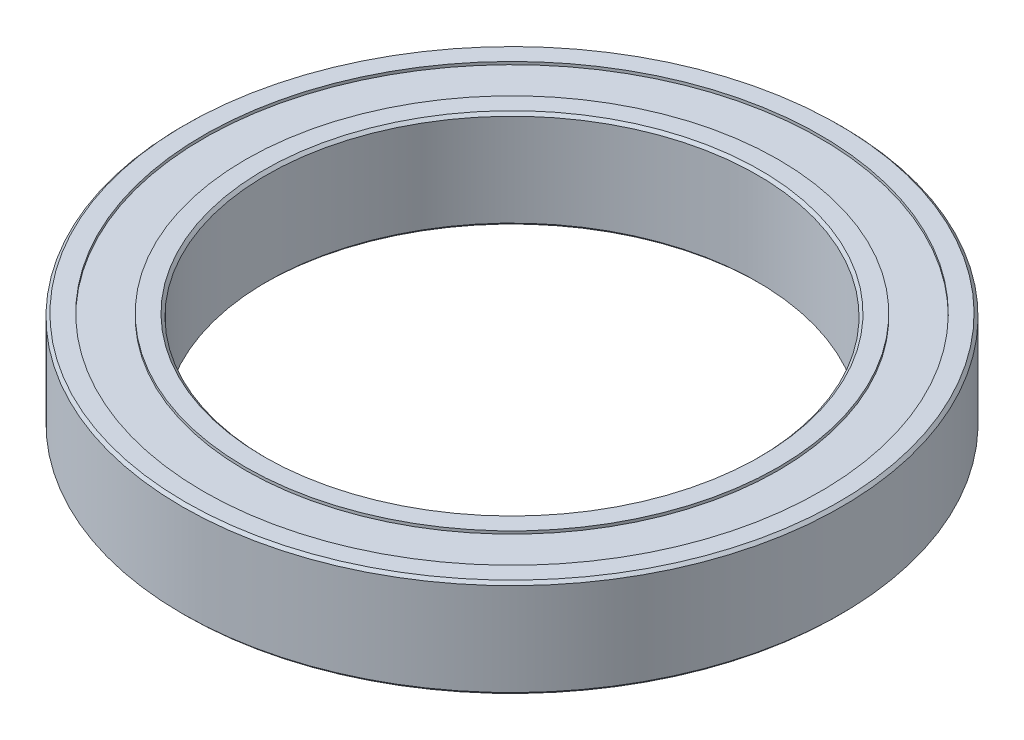
ISO-10303-21;
HEADER;
FILE_DESCRIPTION(('STEP AP214'),'2;1');
FILE_NAME('part.step','',(''),(''),'','','');
FILE_SCHEMA(('AUTOMOTIVE_DESIGN { 1 0 10303 214 1 1 1 1 }'));
ENDSEC;
DATA;
#1=APPLICATION_CONTEXT('core data for automotive mechanical design processes');
#2=APPLICATION_PROTOCOL_DEFINITION('international standard','automotive_design',2000,#1);
#3=PRODUCT_CONTEXT('',#1,'mechanical');
#4=PRODUCT('Part','Part','',(#3));
#5=PRODUCT_RELATED_PRODUCT_CATEGORY('part','',(#4));
#6=PRODUCT_DEFINITION_FORMATION('','',#4);
#7=PRODUCT_DEFINITION_CONTEXT('part definition',#1,'design');
#8=PRODUCT_DEFINITION('design','',#6,#7);
#9=PRODUCT_DEFINITION_SHAPE('','',#8);
#10=(LENGTH_UNIT() NAMED_UNIT(*) SI_UNIT(.MILLI.,.METRE.));
#11=(NAMED_UNIT(*) PLANE_ANGLE_UNIT() SI_UNIT($,.RADIAN.));
#12=(NAMED_UNIT(*) SI_UNIT($,.STERADIAN.) SOLID_ANGLE_UNIT());
#13=UNCERTAINTY_MEASURE_WITH_UNIT(LENGTH_MEASURE(1.E-05),#10,'distance_accuracy_value','');
#14=(GEOMETRIC_REPRESENTATION_CONTEXT(3) GLOBAL_UNCERTAINTY_ASSIGNED_CONTEXT((#13)) GLOBAL_UNIT_ASSIGNED_CONTEXT((#10,
#11,#12)) REPRESENTATION_CONTEXT('',''));
#15=CARTESIAN_POINT('',(0.,0.,0.));
#16=DIRECTION('',(0.,0.,1.));
#17=DIRECTION('',(1.,0.,0.));
#18=AXIS2_PLACEMENT_3D('',#15,#16,#17);
#19=CARTESIAN_POINT('',(0.,0.,0.));
#20=DIRECTION('',(0.,1.,0.));
#21=DIRECTION('',(0.,0.,1.));
#22=AXIS2_PLACEMENT_3D('',#19,#20,#21);
#23=PLANE('',#22);
#24=CARTESIAN_POINT('',(0.,0.,0.));
#25=DIRECTION('',(0.,1.,0.));
#26=DIRECTION('',(0.,0.,1.));
#27=AXIS2_PLACEMENT_3D('',#24,#25,#26);
#28=CIRCLE('',#27,17.7);
#29=CARTESIAN_POINT('',(0.,0.,17.7));
#30=VERTEX_POINT('',#29);
#31=EDGE_CURVE('E10',#30,#30,#28,.T.);
#32=ORIENTED_EDGE('',*,*,#31,.T.);
#33=EDGE_LOOP('',(#32));
#34=FACE_BOUND('',#33,.T.);
#35=CARTESIAN_POINT('',(0.,0.,0.));
#36=DIRECTION('',(0.,-1.,0.));
#37=DIRECTION('',(0.,0.,-1.));
#38=AXIS2_PLACEMENT_3D('',#35,#36,#37);
#39=CIRCLE('',#38,19.);
#40=CARTESIAN_POINT('',(0.,0.,-19.));
#41=VERTEX_POINT('',#40);
#42=EDGE_CURVE('E86',#41,#41,#39,.T.);
#43=ORIENTED_EDGE('',*,*,#42,.T.);
#44=EDGE_LOOP('',(#43));
#45=FACE_BOUND('',#44,.T.);
#46=ADVANCED_FACE('F34',(#34,#45),#23,.F.);
#47=CARTESIAN_POINT('',(0.,7.,0.));
#48=DIRECTION('',(0.,1.,0.));
#49=DIRECTION('',(0.,0.,1.));
#50=AXIS2_PLACEMENT_3D('',#47,#48,#49);
#51=PLANE('',#50);
#52=CARTESIAN_POINT('',(0.,7.,0.));
#53=DIRECTION('',(0.,1.,0.));
#54=DIRECTION('',(0.,0.,1.));
#55=AXIS2_PLACEMENT_3D('',#52,#53,#54);
#56=CIRCLE('',#55,17.7);
#57=CARTESIAN_POINT('',(0.,7.,17.7));
#58=VERTEX_POINT('',#57);
#59=EDGE_CURVE('E42',#58,#58,#56,.F.);
#60=ORIENTED_EDGE('',*,*,#59,.T.);
#61=EDGE_LOOP('',(#60));
#62=FACE_BOUND('',#61,.T.);
#63=CARTESIAN_POINT('',(0.,7.,0.));
#64=DIRECTION('',(0.,1.,0.));
#65=DIRECTION('',(0.,0.,1.));
#66=AXIS2_PLACEMENT_3D('',#63,#64,#65);
#67=CIRCLE('',#66,19.);
#68=CARTESIAN_POINT('',(0.,7.,19.));
#69=VERTEX_POINT('',#68);
#70=EDGE_CURVE('E74',#69,#69,#67,.T.);
#71=ORIENTED_EDGE('',*,*,#70,.T.);
#72=EDGE_LOOP('',(#71));
#73=FACE_BOUND('',#72,.T.);
#74=ADVANCED_FACE('F121',(#62,#73),#51,.T.);
#75=CARTESIAN_POINT('',(0.,7.,0.));
#76=DIRECTION('',(0.,1.,0.));
#77=DIRECTION('',(0.,0.,1.));
#78=AXIS2_PLACEMENT_3D('',#75,#76,#77);
#79=CIRCLE('',#78,23.3);
#80=CARTESIAN_POINT('',(0.,7.,23.3));
#81=VERTEX_POINT('',#80);
#82=EDGE_CURVE('E64',#81,#81,#79,.T.);
#83=ORIENTED_EDGE('',*,*,#82,.T.);
#84=EDGE_LOOP('',(#83));
#85=FACE_BOUND('',#84,.T.);
#86=CARTESIAN_POINT('',(0.,7.,0.));
#87=DIRECTION('',(0.,1.,0.));
#88=DIRECTION('',(0.,0.,1.));
#89=AXIS2_PLACEMENT_3D('',#86,#87,#88);
#90=CIRCLE('',#89,22.);
#91=CARTESIAN_POINT('',(0.,7.,22.));
#92=VERTEX_POINT('',#91);
#93=EDGE_CURVE('E68',#92,#92,#90,.T.);
#94=ORIENTED_EDGE('',*,*,#93,.F.);
#95=EDGE_LOOP('',(#94));
#96=FACE_BOUND('',#95,.T.);
#97=ADVANCED_FACE('F111',(#85,#96),#51,.T.);
#98=CARTESIAN_POINT('',(0.,0.,0.));
#99=DIRECTION('',(0.,1.,0.));
#100=DIRECTION('',(0.,0.,1.));
#101=AXIS2_PLACEMENT_3D('',#98,#99,#100);
#102=CIRCLE('',#101,23.3);
#103=CARTESIAN_POINT('',(0.,0.,23.3));
#104=VERTEX_POINT('',#103);
#105=EDGE_CURVE('E55',#104,#104,#102,.F.);
#106=ORIENTED_EDGE('',*,*,#105,.T.);
#107=EDGE_LOOP('',(#106));
#108=FACE_BOUND('',#107,.T.);
#109=CARTESIAN_POINT('',(0.,0.,0.));
#110=DIRECTION('',(0.,-1.,0.));
#111=DIRECTION('',(0.,0.,-1.));
#112=AXIS2_PLACEMENT_3D('',#109,#110,#111);
#113=CIRCLE('',#112,22.);
#114=CARTESIAN_POINT('',(0.,0.,-22.));
#115=VERTEX_POINT('',#114);
#116=EDGE_CURVE('E80',#115,#115,#113,.T.);
#117=ORIENTED_EDGE('',*,*,#116,.F.);
#118=EDGE_LOOP('',(#117));
#119=FACE_BOUND('',#118,.T.);
#120=ADVANCED_FACE('F108',(#108,#119),#23,.F.);
#121=CARTESIAN_POINT('',(0.,7.,0.));
#122=DIRECTION('',(0.,-1.,0.));
#123=DIRECTION('',(0.,0.,-1.));
#124=AXIS2_PLACEMENT_3D('',#121,#122,#123);
#125=CYLINDRICAL_SURFACE('',#124,23.5);
#126=CARTESIAN_POINT('',(0.,6.8,0.));
#127=DIRECTION('',(0.,1.,0.));
#128=DIRECTION('',(0.,0.,1.));
#129=AXIS2_PLACEMENT_3D('',#126,#127,#128);
#130=CIRCLE('',#129,23.5);
#131=CARTESIAN_POINT('',(0.,6.8,23.5));
#132=VERTEX_POINT('',#131);
#133=EDGE_CURVE('E58',#132,#132,#130,.F.);
#134=ORIENTED_EDGE('',*,*,#133,.T.);
#135=EDGE_LOOP('',(#134));
#136=FACE_BOUND('',#135,.T.);
#137=CARTESIAN_POINT('',(0.,0.200000000000006,0.));
#138=DIRECTION('',(0.,1.,0.));
#139=DIRECTION('',(0.,0.,1.));
#140=AXIS2_PLACEMENT_3D('',#137,#138,#139);
#141=CIRCLE('',#140,23.5);
#142=CARTESIAN_POINT('',(0.,0.200000000000006,23.5));
#143=VERTEX_POINT('',#142);
#144=EDGE_CURVE('E61',#143,#143,#141,.T.);
#145=ORIENTED_EDGE('',*,*,#144,.T.);
#146=EDGE_LOOP('',(#145));
#147=FACE_BOUND('',#146,.T.);
#148=ADVANCED_FACE('F110',(#136,#147),#125,.T.);
#149=CARTESIAN_POINT('',(0.,7.,0.));
#150=DIRECTION('',(0.,-1.,0.));
#151=DIRECTION('',(0.,0.,-1.));
#152=AXIS2_PLACEMENT_3D('',#149,#150,#151);
#153=CYLINDRICAL_SURFACE('',#152,17.5);
#154=CARTESIAN_POINT('',(0.,6.80000000000002,0.));
#155=DIRECTION('',(0.,1.,0.));
#156=DIRECTION('',(0.,0.,1.));
#157=AXIS2_PLACEMENT_3D('',#154,#155,#156);
#158=CIRCLE('',#157,17.5);
#159=CARTESIAN_POINT('',(0.,6.80000000000002,17.5));
#160=VERTEX_POINT('',#159);
#161=EDGE_CURVE('E46',#160,#160,#158,.T.);
#162=ORIENTED_EDGE('',*,*,#161,.T.);
#163=EDGE_LOOP('',(#162));
#164=FACE_BOUND('',#163,.T.);
#165=CARTESIAN_POINT('',(0.,0.199999999999999,0.));
#166=DIRECTION('',(0.,1.,0.));
#167=DIRECTION('',(0.,0.,1.));
#168=AXIS2_PLACEMENT_3D('',#165,#166,#167);
#169=CIRCLE('',#168,17.5);
#170=CARTESIAN_POINT('',(0.,0.199999999999999,17.5));
#171=VERTEX_POINT('',#170);
#172=EDGE_CURVE('E50',#171,#171,#169,.F.);
#173=ORIENTED_EDGE('',*,*,#172,.T.);
#174=EDGE_LOOP('',(#173));
#175=FACE_BOUND('',#174,.T.);
#176=ADVANCED_FACE('F118',(#164,#175),#153,.F.);
#177=CARTESIAN_POINT('',(0.,6.8,0.));
#178=DIRECTION('',(0.,1.,0.));
#179=DIRECTION('',(0.,0.,1.));
#180=AXIS2_PLACEMENT_3D('',#177,#178,#179);
#181=CYLINDRICAL_SURFACE('',#180,22.);
#182=CARTESIAN_POINT('',(0.,6.8,0.));
#183=DIRECTION('',(0.,1.,0.));
#184=DIRECTION('',(0.,0.,1.));
#185=AXIS2_PLACEMENT_3D('',#182,#183,#184);
#186=CIRCLE('',#185,22.);
#187=CARTESIAN_POINT('',(0.,6.8,22.));
#188=VERTEX_POINT('',#187);
#189=EDGE_CURVE('E67',#188,#188,#186,.T.);
#190=ORIENTED_EDGE('',*,*,#189,.F.);
#191=EDGE_LOOP('',(#190));
#192=FACE_BOUND('',#191,.T.);
#193=ORIENTED_EDGE('',*,*,#93,.T.);
#194=EDGE_LOOP('',(#193));
#195=FACE_BOUND('',#194,.T.);
#196=ADVANCED_FACE('F146',(#192,#195),#181,.F.);
#197=CARTESIAN_POINT('',(0.,6.8,0.));
#198=DIRECTION('',(0.,1.,0.));
#199=DIRECTION('',(0.,0.,1.));
#200=AXIS2_PLACEMENT_3D('',#197,#198,#199);
#201=PLANE('',#200);
#202=CARTESIAN_POINT('',(0.,6.8,0.));
#203=DIRECTION('',(0.,1.,0.));
#204=DIRECTION('',(0.,0.,1.));
#205=AXIS2_PLACEMENT_3D('',#202,#203,#204);
#206=CIRCLE('',#205,19.);
#207=CARTESIAN_POINT('',(0.,6.8,19.));
#208=VERTEX_POINT('',#207);
#209=EDGE_CURVE('E71',#208,#208,#206,.T.);
#210=ORIENTED_EDGE('',*,*,#209,.F.);
#211=EDGE_LOOP('',(#210));
#212=FACE_BOUND('',#211,.T.);
#213=ORIENTED_EDGE('',*,*,#189,.T.);
#214=EDGE_LOOP('',(#213));
#215=FACE_BOUND('',#214,.T.);
#216=ADVANCED_FACE('F142',(#212,#215),#201,.T.);
#217=CARTESIAN_POINT('',(0.,6.8,0.));
#218=DIRECTION('',(0.,1.,0.));
#219=DIRECTION('',(0.,0.,1.));
#220=AXIS2_PLACEMENT_3D('',#217,#218,#219);
#221=CYLINDRICAL_SURFACE('',#220,19.);
#222=ORIENTED_EDGE('',*,*,#209,.T.);
#223=EDGE_LOOP('',(#222));
#224=FACE_BOUND('',#223,.T.);
#225=ORIENTED_EDGE('',*,*,#70,.F.);
#226=EDGE_LOOP('',(#225));
#227=FACE_BOUND('',#226,.T.);
#228=ADVANCED_FACE('F104',(#224,#227),#221,.T.);
#229=CARTESIAN_POINT('',(0.,0.2,0.));
#230=DIRECTION('',(0.,-1.,0.));
#231=DIRECTION('',(0.,0.,-1.));
#232=AXIS2_PLACEMENT_3D('',#229,#230,#231);
#233=CYLINDRICAL_SURFACE('',#232,22.);
#234=CARTESIAN_POINT('',(0.,0.2,0.));
#235=DIRECTION('',(0.,-1.,0.));
#236=DIRECTION('',(0.,0.,-1.));
#237=AXIS2_PLACEMENT_3D('',#234,#235,#236);
#238=CIRCLE('',#237,22.);
#239=CARTESIAN_POINT('',(0.,0.2,-22.));
#240=VERTEX_POINT('',#239);
#241=EDGE_CURVE('E77',#240,#240,#238,.T.);
#242=ORIENTED_EDGE('',*,*,#241,.F.);
#243=EDGE_LOOP('',(#242));
#244=FACE_BOUND('',#243,.T.);
#245=ORIENTED_EDGE('',*,*,#116,.T.);
#246=EDGE_LOOP('',(#245));
#247=FACE_BOUND('',#246,.T.);
#248=ADVANCED_FACE('F98',(#244,#247),#233,.F.);
#249=CARTESIAN_POINT('',(0.,0.2,0.));
#250=DIRECTION('',(0.,-1.,0.));
#251=DIRECTION('',(0.,0.,-1.));
#252=AXIS2_PLACEMENT_3D('',#249,#250,#251);
#253=PLANE('',#252);
#254=CARTESIAN_POINT('',(0.,0.2,0.));
#255=DIRECTION('',(0.,-1.,0.));
#256=DIRECTION('',(0.,0.,-1.));
#257=AXIS2_PLACEMENT_3D('',#254,#255,#256);
#258=CIRCLE('',#257,19.);
#259=CARTESIAN_POINT('',(0.,0.2,-19.));
#260=VERTEX_POINT('',#259);
#261=EDGE_CURVE('E83',#260,#260,#258,.T.);
#262=ORIENTED_EDGE('',*,*,#261,.F.);
#263=EDGE_LOOP('',(#262));
#264=FACE_BOUND('',#263,.T.);
#265=ORIENTED_EDGE('',*,*,#241,.T.);
#266=EDGE_LOOP('',(#265));
#267=FACE_BOUND('',#266,.T.);
#268=ADVANCED_FACE('F95',(#264,#267),#253,.T.);
#269=CARTESIAN_POINT('',(0.,0.2,0.));
#270=DIRECTION('',(0.,-1.,0.));
#271=DIRECTION('',(0.,0.,-1.));
#272=AXIS2_PLACEMENT_3D('',#269,#270,#271);
#273=CYLINDRICAL_SURFACE('',#272,19.);
#274=ORIENTED_EDGE('',*,*,#261,.T.);
#275=EDGE_LOOP('',(#274));
#276=FACE_BOUND('',#275,.T.);
#277=ORIENTED_EDGE('',*,*,#42,.F.);
#278=EDGE_LOOP('',(#277));
#279=FACE_BOUND('',#278,.T.);
#280=ADVANCED_FACE('F92',(#276,#279),#273,.T.);
#281=CARTESIAN_POINT('',(0.,7.,0.));
#282=DIRECTION('',(0.,-1.,0.));
#283=DIRECTION('',(0.,0.,-1.));
#284=AXIS2_PLACEMENT_3D('',#281,#282,#283);
#285=CONICAL_SURFACE('',#284,23.3,0.785398163397431);
#286=ORIENTED_EDGE('',*,*,#133,.F.);
#287=EDGE_LOOP('',(#286));
#288=FACE_BOUND('',#287,.T.);
#289=ORIENTED_EDGE('',*,*,#82,.F.);
#290=EDGE_LOOP('',(#289));
#291=FACE_BOUND('',#290,.T.);
#292=ADVANCED_FACE('F131',(#288,#291),#285,.T.);
#293=CARTESIAN_POINT('',(0.,0.200000000000006,0.));
#294=DIRECTION('',(0.,1.,0.));
#295=DIRECTION('',(0.,0.,1.));
#296=AXIS2_PLACEMENT_3D('',#293,#294,#295);
#297=CONICAL_SURFACE('',#296,23.5,0.785398163397448);
#298=ORIENTED_EDGE('',*,*,#105,.F.);
#299=EDGE_LOOP('',(#298));
#300=FACE_BOUND('',#299,.T.);
#301=ORIENTED_EDGE('',*,*,#144,.F.);
#302=EDGE_LOOP('',(#301));
#303=FACE_BOUND('',#302,.T.);
#304=ADVANCED_FACE('F136',(#300,#303),#297,.T.);
#305=CARTESIAN_POINT('',(0.,6.80000000000002,0.));
#306=DIRECTION('',(0.,1.,0.));
#307=DIRECTION('',(0.,0.,1.));
#308=AXIS2_PLACEMENT_3D('',#305,#306,#307);
#309=CONICAL_SURFACE('',#308,17.5,0.785398163397457);
#310=CARTESIAN_POINT('',(0.,7.,17.7));
#311=CARTESIAN_POINT('',(0.,6.99791666666667,17.6979166666667));
#312=CARTESIAN_POINT('',(0.,6.99583333333333,17.6958333333333));
#313=CARTESIAN_POINT('',(0.,6.99166666666667,17.6916666666667));
#314=CARTESIAN_POINT('',(0.,6.98958333333333,17.6895833333333));
#315=CARTESIAN_POINT('',(0.,6.98541666666667,17.6854166666667));
#316=CARTESIAN_POINT('',(0.,6.98333333333334,17.6833333333333));
#317=CARTESIAN_POINT('',(0.,6.97916666666667,17.6791666666667));
#318=CARTESIAN_POINT('',(0.,6.97708333333334,17.6770833333333));
#319=CARTESIAN_POINT('',(0.,6.97291666666667,17.6729166666667));
#320=CARTESIAN_POINT('',(0.,6.97083333333334,17.6708333333333));
#321=CARTESIAN_POINT('',(0.,6.96666666666667,17.6666666666667));
#322=CARTESIAN_POINT('',(0.,6.96458333333334,17.6645833333333));
#323=CARTESIAN_POINT('',(0.,6.96041666666667,17.6604166666667));
#324=CARTESIAN_POINT('',(0.,6.95833333333334,17.6583333333333));
#325=CARTESIAN_POINT('',(0.,6.95416666666667,17.6541666666667));
#326=CARTESIAN_POINT('',(0.,6.95208333333334,17.6520833333333));
#327=CARTESIAN_POINT('',(0.,6.94791666666667,17.6479166666667));
#328=CARTESIAN_POINT('',(0.,6.94583333333334,17.6458333333333));
#329=CARTESIAN_POINT('',(0.,6.94166666666667,17.6416666666667));
#330=CARTESIAN_POINT('',(0.,6.93958333333334,17.6395833333333));
#331=CARTESIAN_POINT('',(0.,6.93541666666667,17.6354166666667));
#332=CARTESIAN_POINT('',(0.,6.93333333333334,17.6333333333333));
#333=CARTESIAN_POINT('',(0.,6.92916666666667,17.6291666666667));
#334=CARTESIAN_POINT('',(0.,6.92708333333334,17.6270833333333));
#335=CARTESIAN_POINT('',(0.,6.92291666666667,17.6229166666667));
#336=CARTESIAN_POINT('',(0.,6.92083333333334,17.6208333333333));
#337=CARTESIAN_POINT('',(0.,6.91666666666668,17.6166666666667));
#338=CARTESIAN_POINT('',(0.,6.91458333333334,17.6145833333333));
#339=CARTESIAN_POINT('',(0.,6.91041666666668,17.6104166666667));
#340=CARTESIAN_POINT('',(0.,6.90833333333334,17.6083333333333));
#341=CARTESIAN_POINT('',(0.,6.90416666666668,17.6041666666667));
#342=CARTESIAN_POINT('',(0.,6.90208333333334,17.6020833333333));
#343=CARTESIAN_POINT('',(0.,6.89791666666668,17.5979166666667));
#344=CARTESIAN_POINT('',(0.,6.89583333333334,17.5958333333333));
#345=CARTESIAN_POINT('',(0.,6.89166666666668,17.5916666666667));
#346=CARTESIAN_POINT('',(0.,6.88958333333335,17.5895833333333));
#347=CARTESIAN_POINT('',(0.,6.88541666666668,17.5854166666667));
#348=CARTESIAN_POINT('',(0.,6.88333333333335,17.5833333333333));
#349=CARTESIAN_POINT('',(0.,6.87916666666668,17.5791666666667));
#350=CARTESIAN_POINT('',(0.,6.87708333333335,17.5770833333333));
#351=CARTESIAN_POINT('',(0.,6.87291666666668,17.5729166666667));
#352=CARTESIAN_POINT('',(0.,6.87083333333335,17.5708333333333));
#353=CARTESIAN_POINT('',(0.,6.86666666666668,17.5666666666667));
#354=CARTESIAN_POINT('',(0.,6.86458333333335,17.5645833333333));
#355=CARTESIAN_POINT('',(0.,6.86041666666668,17.5604166666667));
#356=CARTESIAN_POINT('',(0.,6.85833333333335,17.5583333333333));
#357=CARTESIAN_POINT('',(0.,6.85416666666668,17.5541666666667));
#358=CARTESIAN_POINT('',(0.,6.85208333333335,17.5520833333333));
#359=CARTESIAN_POINT('',(0.,6.84791666666668,17.5479166666667));
#360=CARTESIAN_POINT('',(0.,6.84583333333335,17.5458333333333));
#361=CARTESIAN_POINT('',(0.,6.84166666666668,17.5416666666667));
#362=CARTESIAN_POINT('',(0.,6.83958333333335,17.5395833333333));
#363=CARTESIAN_POINT('',(0.,6.83541666666668,17.5354166666667));
#364=CARTESIAN_POINT('',(0.,6.83333333333335,17.5333333333333));
#365=CARTESIAN_POINT('',(0.,6.82916666666668,17.5291666666667));
#366=CARTESIAN_POINT('',(0.,6.82708333333335,17.5270833333333));
#367=CARTESIAN_POINT('',(0.,6.82291666666669,17.5229166666667));
#368=CARTESIAN_POINT('',(0.,6.82083333333335,17.5208333333333));
#369=CARTESIAN_POINT('',(0.,6.81666666666669,17.5166666666667));
#370=CARTESIAN_POINT('',(0.,6.81458333333335,17.5145833333333));
#371=CARTESIAN_POINT('',(0.,6.81041666666669,17.5104166666667));
#372=CARTESIAN_POINT('',(0.,6.80833333333335,17.5083333333333));
#373=CARTESIAN_POINT('',(0.,6.80416666666669,17.5041666666667));
#374=CARTESIAN_POINT('',(0.,6.80208333333336,17.5020833333333));
#375=CARTESIAN_POINT('',(0.,6.80000000000002,17.5));
#376=B_SPLINE_CURVE_WITH_KNOTS('',3,(#310,#311,#312,#313,#314,#315,#316,#317,#318,#319,#320,
#321,#322,#323,#324,#325,#326,#327,#328,#329,#330,#331,#332,#333,#334,#335,#336,#337,#338,#339,
#340,#341,#342,#343,#344,#345,#346,#347,#348,#349,#350,#351,#352,#353,#354,#355,#356,#357,#358,
#359,#360,#361,#362,#363,#364,#365,#366,#367,#368,#369,#370,#371,#372,#373,#374,#375),
.UNSPECIFIED.,.F.,.F.,(4,2,2,2,2,2,2,2,2,2,2,2,2,2,2,2,2,2,2,2,2,2,2,2,2,2,2,2,2,2,2,2,4),(0.,
0.00883883476483087,0.0176776695296617,0.0265165042944926,0.0353553390593235,0.0441941738241543,
0.0530330085889852,0.0618718433538161,0.070710678118647,0.0795495128834778,0.0883883476483087,
0.0972271824131395,0.106066017177971,0.114904851942804,0.123743686707635,0.132582521472465,
0.141421356237296,0.150260191002127,0.159099025766958,0.167937860531789,0.17677669529662,
0.185615530061451,0.194454364826282,0.203293199591113,0.212132034355944,0.220970869120775,
0.229809703885606,0.238648538650437,0.247487373415268,0.256326208180098,0.265165042944929,
0.27400387770976,0.28284271247459),.UNSPECIFIED.);
#377=EDGE_CURVE('BSEAM161',#58,#160,#376,.T.);
#378=ORIENTED_EDGE('',*,*,#59,.F.);
#379=ORIENTED_EDGE('',*,*,#161,.F.);
#380=ORIENTED_EDGE('',*,*,#377,.T.);
#381=ORIENTED_EDGE('',*,*,#377,.F.);
#382=EDGE_LOOP('',(#378,#380,#379,#381));
#383=FACE_BOUND('',#382,.T.);
#384=ADVANCED_FACE('F161',(#383),#309,.F.);
#385=CARTESIAN_POINT('',(0.,0.,0.));
#386=DIRECTION('',(0.,-1.,0.));
#387=DIRECTION('',(0.,0.,-1.));
#388=AXIS2_PLACEMENT_3D('',#385,#386,#387);
#389=CONICAL_SURFACE('',#388,17.7,0.78539816339744);
#390=ORIENTED_EDGE('',*,*,#172,.F.);
#391=EDGE_LOOP('',(#390));
#392=FACE_BOUND('',#391,.T.);
#393=ORIENTED_EDGE('',*,*,#31,.F.);
#394=EDGE_LOOP('',(#393));
#395=FACE_BOUND('',#394,.T.);
#396=ADVANCED_FACE('F37',(#392,#395),#389,.F.);
#397=CLOSED_SHELL('',(#46,#74,#97,#120,#148,#176,#196,#216,#228,#248,#268,#280,#292,#304,#384,#396));
#398=MANIFOLD_SOLID_BREP('B2',#397);
#399=ADVANCED_BREP_SHAPE_REPRESENTATION('',(#18,#398),#14);
#400=SHAPE_DEFINITION_REPRESENTATION(#9,#399);
ENDSEC;
END-ISO-10303-21;
